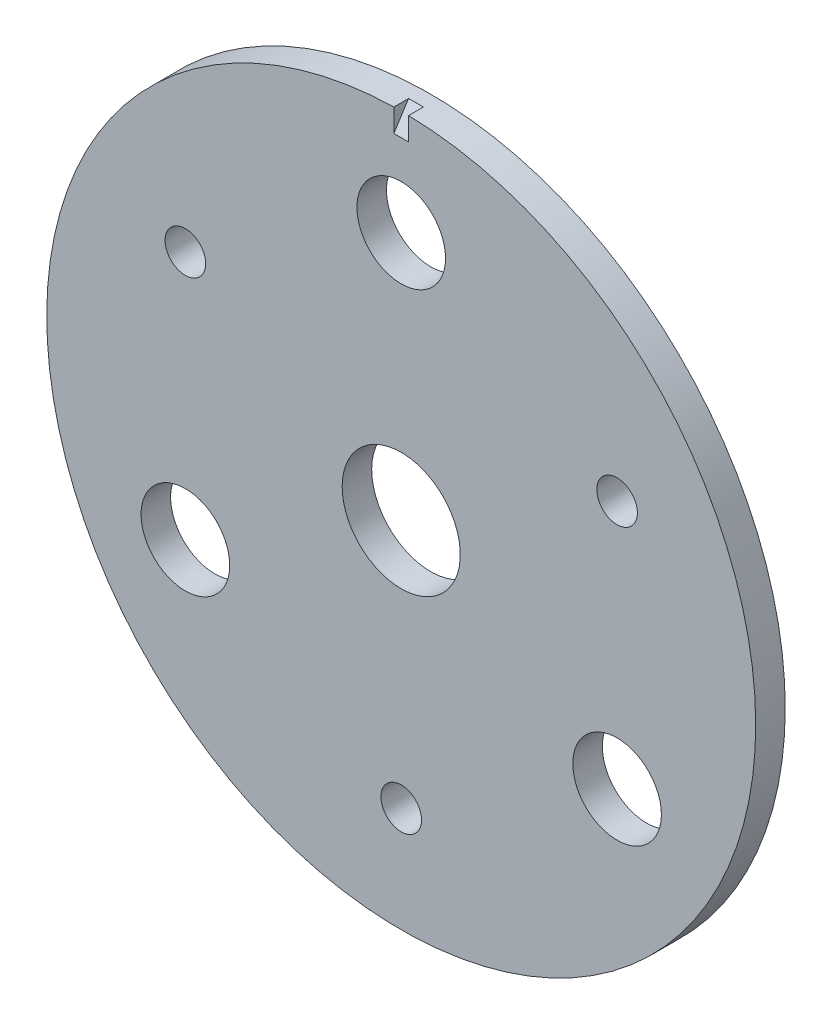
ISO-10303-21;
HEADER;
FILE_DESCRIPTION(('STEP AP214'),'2;1');
FILE_NAME('part.step','',(''),(''),'','','');
FILE_SCHEMA(('AUTOMOTIVE_DESIGN { 1 0 10303 214 1 1 1 1 }'));
ENDSEC;
DATA;
#1=APPLICATION_CONTEXT('core data for automotive mechanical design processes');
#2=APPLICATION_PROTOCOL_DEFINITION('international standard','automotive_design',2000,#1);
#3=PRODUCT_CONTEXT('',#1,'mechanical');
#4=PRODUCT('Part','Part','',(#3));
#5=PRODUCT_RELATED_PRODUCT_CATEGORY('part','',(#4));
#6=PRODUCT_DEFINITION_FORMATION('','',#4);
#7=PRODUCT_DEFINITION_CONTEXT('part definition',#1,'design');
#8=PRODUCT_DEFINITION('design','',#6,#7);
#9=PRODUCT_DEFINITION_SHAPE('','',#8);
#10=(LENGTH_UNIT() NAMED_UNIT(*) SI_UNIT(.MILLI.,.METRE.));
#11=(NAMED_UNIT(*) PLANE_ANGLE_UNIT() SI_UNIT($,.RADIAN.));
#12=(NAMED_UNIT(*) SI_UNIT($,.STERADIAN.) SOLID_ANGLE_UNIT());
#13=UNCERTAINTY_MEASURE_WITH_UNIT(LENGTH_MEASURE(1.E-05),#10,'distance_accuracy_value','');
#14=(GEOMETRIC_REPRESENTATION_CONTEXT(3) GLOBAL_UNCERTAINTY_ASSIGNED_CONTEXT((#13)) GLOBAL_UNIT_ASSIGNED_CONTEXT((#10,
#11,#12)) REPRESENTATION_CONTEXT('',''));
#15=CARTESIAN_POINT('',(0.,0.,0.));
#16=DIRECTION('',(0.,0.,1.));
#17=DIRECTION('',(1.,0.,0.));
#18=AXIS2_PLACEMENT_3D('',#15,#16,#17);
#19=CARTESIAN_POINT('',(0.,0.,2.));
#20=DIRECTION('',(0.,0.,1.));
#21=DIRECTION('',(1.,0.,0.));
#22=AXIS2_PLACEMENT_3D('',#19,#20,#21);
#23=PLANE('',#22);
#24=CARTESIAN_POINT('',(29.2283573777248,16.875,2.));
#25=DIRECTION('',(0.,0.,1.));
#26=DIRECTION('',(1.,0.,0.));
#27=AXIS2_PLACEMENT_3D('',#24,#25,#26);
#28=CIRCLE('',#27,2.75);
#29=CARTESIAN_POINT('',(26.4783573777248,16.875,2.));
#30=VERTEX_POINT('',#29);
#31=EDGE_CURVE('E44',#30,#30,#28,.F.);
#32=ORIENTED_EDGE('',*,*,#31,.T.);
#33=EDGE_LOOP('',(#32));
#34=FACE_BOUND('',#33,.T.);
#35=CARTESIAN_POINT('',(-29.2283573777248,16.875,2.));
#36=DIRECTION('',(0.,0.,1.));
#37=DIRECTION('',(1.,0.,0.));
#38=AXIS2_PLACEMENT_3D('',#35,#36,#37);
#39=CIRCLE('',#38,2.75);
#40=CARTESIAN_POINT('',(-31.9783573777248,16.875,2.));
#41=VERTEX_POINT('',#40);
#42=EDGE_CURVE('E172',#41,#41,#39,.F.);
#43=ORIENTED_EDGE('',*,*,#42,.T.);
#44=EDGE_LOOP('',(#43));
#45=FACE_BOUND('',#44,.T.);
#46=CARTESIAN_POINT('',(0.,-33.75,2.));
#47=DIRECTION('',(0.,0.,1.));
#48=DIRECTION('',(1.,0.,0.));
#49=AXIS2_PLACEMENT_3D('',#46,#47,#48);
#50=CIRCLE('',#49,2.75);
#51=CARTESIAN_POINT('',(-2.75,-33.75,2.));
#52=VERTEX_POINT('',#51);
#53=EDGE_CURVE('E167',#52,#52,#50,.F.);
#54=ORIENTED_EDGE('',*,*,#53,.T.);
#55=EDGE_LOOP('',(#54));
#56=FACE_BOUND('',#55,.T.);
#57=CARTESIAN_POINT('',(-29.2283573777247,-16.8750000000001,2.));
#58=DIRECTION('',(0.,0.,1.));
#59=DIRECTION('',(1.,0.,0.));
#60=AXIS2_PLACEMENT_3D('',#57,#58,#59);
#61=CIRCLE('',#60,6.);
#62=CARTESIAN_POINT('',(-23.2283573777247,-16.8750000000001,2.));
#63=VERTEX_POINT('',#62);
#64=EDGE_CURVE('E115',#63,#63,#61,.T.);
#65=ORIENTED_EDGE('',*,*,#64,.F.);
#66=EDGE_LOOP('',(#65));
#67=FACE_BOUND('',#66,.T.);
#68=CARTESIAN_POINT('',(29.228357377725,-16.8749999999997,2.));
#69=DIRECTION('',(0.,0.,1.));
#70=DIRECTION('',(1.,0.,0.));
#71=AXIS2_PLACEMENT_3D('',#68,#69,#70);
#72=CIRCLE('',#71,6.);
#73=CARTESIAN_POINT('',(35.228357377725,-16.8749999999997,2.));
#74=VERTEX_POINT('',#73);
#75=EDGE_CURVE('E110',#74,#74,#72,.T.);
#76=ORIENTED_EDGE('',*,*,#75,.F.);
#77=EDGE_LOOP('',(#76));
#78=FACE_BOUND('',#77,.T.);
#79=CARTESIAN_POINT('',(0.,33.75,2.000012));
#80=DIRECTION('',(0.,0.,1.));
#81=DIRECTION('',(1.,0.,0.));
#82=AXIS2_PLACEMENT_3D('',#79,#80,#81);
#83=CIRCLE('',#82,6.);
#84=CARTESIAN_POINT('',(6.,33.75,2.000012));
#85=VERTEX_POINT('',#84);
#86=EDGE_CURVE('E116',#85,#85,#83,.T.);
#87=ORIENTED_EDGE('',*,*,#86,.F.);
#88=EDGE_LOOP('',(#87));
#89=FACE_BOUND('',#88,.T.);
#90=CARTESIAN_POINT('',(0.,0.,2.));
#91=DIRECTION('',(0.,0.,1.));
#92=DIRECTION('',(1.,0.,0.));
#93=AXIS2_PLACEMENT_3D('',#90,#91,#92);
#94=CIRCLE('',#93,8.);
#95=CARTESIAN_POINT('',(-8.,0.,2.));
#96=VERTEX_POINT('',#95);
#97=EDGE_CURVE('E129',#96,#96,#94,.T.);
#98=ORIENTED_EDGE('',*,*,#97,.F.);
#99=EDGE_LOOP('',(#98));
#100=FACE_BOUND('',#99,.T.);
#101=CARTESIAN_POINT('',(0.,0.,2.));
#102=DIRECTION('',(0.,0.,1.));
#103=DIRECTION('',(1.,0.,0.));
#104=AXIS2_PLACEMENT_3D('',#101,#102,#103);
#105=CIRCLE('',#104,48.);
#106=CARTESIAN_POINT('',(-1.,47.9895822028073,2.));
#107=VERTEX_POINT('',#106);
#108=CARTESIAN_POINT('',(1.,47.9895822028073,2.));
#109=VERTEX_POINT('',#108);
#110=EDGE_CURVE('E170',#107,#109,#105,.T.);
#111=ORIENTED_EDGE('',*,*,#110,.T.);
#112=DIRECTION('',(0.,-1.,0.));
#113=VECTOR('',#112,1.);
#114=CARTESIAN_POINT('',(1.,48.,2.));
#115=LINE('',#114,#113);
#116=CARTESIAN_POINT('',(1.,44.8897446082717,2.));
#117=VERTEX_POINT('',#116);
#118=EDGE_CURVE('E56',#109,#117,#115,.T.);
#119=ORIENTED_EDGE('',*,*,#118,.T.);
#120=DIRECTION('',(1.,0.,0.));
#121=VECTOR('',#120,1.);
#122=CARTESIAN_POINT('',(-1.,44.8897446082717,2.));
#123=LINE('',#122,#121);
#124=CARTESIAN_POINT('',(-1.,44.8897446082717,2.));
#125=VERTEX_POINT('',#124);
#126=EDGE_CURVE('E91',#125,#117,#123,.T.);
#127=ORIENTED_EDGE('',*,*,#126,.F.);
#128=DIRECTION('',(0.,-1.,0.));
#129=VECTOR('',#128,1.);
#130=CARTESIAN_POINT('',(-0.999999999999999,48.,2.));
#131=LINE('',#130,#129);
#132=EDGE_CURVE('E78',#107,#125,#131,.T.);
#133=ORIENTED_EDGE('',*,*,#132,.F.);
#134=EDGE_LOOP('',(#111,#119,#127,#133));
#135=FACE_BOUND('',#134,.T.);
#136=ADVANCED_FACE('F41',(#34,#45,#56,#67,#78,#89,#100,#135),#23,.T.);
#137=CARTESIAN_POINT('',(0.,0.,-2.));
#138=DIRECTION('',(0.,0.,1.));
#139=DIRECTION('',(1.,0.,0.));
#140=AXIS2_PLACEMENT_3D('',#137,#138,#139);
#141=PLANE('',#140);
#142=CARTESIAN_POINT('',(29.2283573777248,16.875,-2.));
#143=DIRECTION('',(0.,0.,1.));
#144=DIRECTION('',(-0.5,0.866025403784439,0.));
#145=AXIS2_PLACEMENT_3D('',#142,#143,#144);
#146=CIRCLE('',#145,2.75);
#147=CARTESIAN_POINT('',(26.4783573777248,16.875,-2.));
#148=VERTEX_POINT('',#147);
#149=EDGE_CURVE('E180',#148,#148,#146,.T.);
#150=ORIENTED_EDGE('',*,*,#149,.T.);
#151=EDGE_LOOP('',(#150));
#152=FACE_BOUND('',#151,.T.);
#153=CARTESIAN_POINT('',(-29.2283573777248,16.875,-2.));
#154=DIRECTION('',(0.,0.,1.));
#155=DIRECTION('',(-0.5,-0.866025403784438,0.));
#156=AXIS2_PLACEMENT_3D('',#153,#154,#155);
#157=CIRCLE('',#156,2.75);
#158=CARTESIAN_POINT('',(-31.9783573777248,16.875,-2.));
#159=VERTEX_POINT('',#158);
#160=EDGE_CURVE('E184',#159,#159,#157,.T.);
#161=ORIENTED_EDGE('',*,*,#160,.T.);
#162=EDGE_LOOP('',(#161));
#163=FACE_BOUND('',#162,.T.);
#164=CARTESIAN_POINT('',(0.,-33.75,-2.));
#165=DIRECTION('',(0.,0.,1.));
#166=DIRECTION('',(1.,0.,0.));
#167=AXIS2_PLACEMENT_3D('',#164,#165,#166);
#168=CIRCLE('',#167,2.75);
#169=CARTESIAN_POINT('',(-2.75,-33.75,-2.));
#170=VERTEX_POINT('',#169);
#171=EDGE_CURVE('E173',#170,#170,#168,.T.);
#172=ORIENTED_EDGE('',*,*,#171,.T.);
#173=EDGE_LOOP('',(#172));
#174=FACE_BOUND('',#173,.T.);
#175=CARTESIAN_POINT('',(-29.2283573777247,-16.8750000000001,-2.));
#176=DIRECTION('',(0.,0.,1.));
#177=DIRECTION('',(-0.500000000000004,0.866025403784437,0.));
#178=AXIS2_PLACEMENT_3D('',#175,#176,#177);
#179=CIRCLE('',#178,6.);
#180=CARTESIAN_POINT('',(-23.2283573777247,-16.8750000000001,-2.));
#181=VERTEX_POINT('',#180);
#182=EDGE_CURVE('E99',#181,#181,#179,.T.);
#183=ORIENTED_EDGE('',*,*,#182,.T.);
#184=EDGE_LOOP('',(#183));
#185=FACE_BOUND('',#184,.T.);
#186=CARTESIAN_POINT('',(29.228357377725,-16.8749999999997,-2.));
#187=DIRECTION('',(0.,0.,1.));
#188=DIRECTION('',(-0.499999999999992,-0.866025403784443,0.));
#189=AXIS2_PLACEMENT_3D('',#186,#187,#188);
#190=CIRCLE('',#189,6.);
#191=CARTESIAN_POINT('',(35.228357377725,-16.8749999999997,-2.));
#192=VERTEX_POINT('',#191);
#193=EDGE_CURVE('E95',#192,#192,#190,.T.);
#194=ORIENTED_EDGE('',*,*,#193,.T.);
#195=EDGE_LOOP('',(#194));
#196=FACE_BOUND('',#195,.T.);
#197=CARTESIAN_POINT('',(0.,33.75,-2.));
#198=DIRECTION('',(0.,0.,1.));
#199=DIRECTION('',(1.,0.,0.));
#200=AXIS2_PLACEMENT_3D('',#197,#198,#199);
#201=CIRCLE('',#200,6.);
#202=CARTESIAN_POINT('',(6.,33.75,-2.));
#203=VERTEX_POINT('',#202);
#204=EDGE_CURVE('E120',#203,#203,#201,.T.);
#205=ORIENTED_EDGE('',*,*,#204,.T.);
#206=EDGE_LOOP('',(#205));
#207=FACE_BOUND('',#206,.T.);
#208=CARTESIAN_POINT('',(0.,0.,-2.));
#209=DIRECTION('',(0.,0.,1.));
#210=DIRECTION('',(1.,0.,0.));
#211=AXIS2_PLACEMENT_3D('',#208,#209,#210);
#212=CIRCLE('',#211,48.);
#213=CARTESIAN_POINT('',(48.,0.,-2.));
#214=VERTEX_POINT('',#213);
#215=EDGE_CURVE('E204',#214,#214,#212,.T.);
#216=ORIENTED_EDGE('',*,*,#215,.F.);
#217=EDGE_LOOP('',(#216));
#218=FACE_BOUND('',#217,.T.);
#219=CARTESIAN_POINT('',(0.,0.,-2.));
#220=DIRECTION('',(0.,0.,1.));
#221=DIRECTION('',(1.,0.,0.));
#222=AXIS2_PLACEMENT_3D('',#219,#220,#221);
#223=CIRCLE('',#222,8.);
#224=CARTESIAN_POINT('',(-8.,0.,-2.));
#225=VERTEX_POINT('',#224);
#226=EDGE_CURVE('E122',#225,#225,#223,.T.);
#227=ORIENTED_EDGE('',*,*,#226,.T.);
#228=EDGE_LOOP('',(#227));
#229=FACE_BOUND('',#228,.T.);
#230=ADVANCED_FACE('F153',(#152,#163,#174,#185,#196,#207,#218,#229),#141,.F.);
#231=CARTESIAN_POINT('',(0.,0.,2.));
#232=DIRECTION('',(0.,0.,-1.));
#233=DIRECTION('',(-1.,0.,0.));
#234=AXIS2_PLACEMENT_3D('',#231,#232,#233);
#235=CYLINDRICAL_SURFACE('',#234,48.);
#236=DIRECTION('',(0.,0.,-1.));
#237=VECTOR('',#236,1.);
#238=CARTESIAN_POINT('',(-1.,47.9895822028073,2.));
#239=LINE('',#238,#237);
#240=CARTESIAN_POINT('',(-1.,47.9895822028073,0.006698997915347));
#241=VERTEX_POINT('',#240);
#242=EDGE_CURVE('E11',#107,#241,#239,.T.);
#243=ORIENTED_EDGE('',*,*,#242,.T.);
#244=CARTESIAN_POINT('',(0.,0.,30.8656325314346));
#245=DIRECTION('',(0.,-0.540862850942179,-0.841110799164235));
#246=DIRECTION('',(0.,0.841110799164235,-0.540862850942178));
#247=AXIS2_PLACEMENT_3D('',#244,#245,#246);
#248=ELLIPSE('',#247,57.0673923669687,48.);
#249=CARTESIAN_POINT('',(1.,47.9895822028073,0.006698997915347));
#250=VERTEX_POINT('',#249);
#251=EDGE_CURVE('E51',#241,#250,#248,.T.);
#252=ORIENTED_EDGE('',*,*,#251,.T.);
#253=DIRECTION('',(0.,0.,-1.));
#254=VECTOR('',#253,1.);
#255=CARTESIAN_POINT('',(1.,47.9895822028073,2.));
#256=LINE('',#255,#254);
#257=EDGE_CURVE('E158',#109,#250,#256,.T.);
#258=ORIENTED_EDGE('',*,*,#257,.F.);
#259=ORIENTED_EDGE('',*,*,#110,.F.);
#260=EDGE_LOOP('',(#243,#252,#258,#259));
#261=FACE_BOUND('',#260,.T.);
#262=ORIENTED_EDGE('',*,*,#215,.T.);
#263=EDGE_LOOP('',(#262));
#264=FACE_BOUND('',#263,.T.);
#265=ADVANCED_FACE('F43',(#261,#264),#235,.T.);
#266=CARTESIAN_POINT('',(0.,0.,2.));
#267=DIRECTION('',(0.,0.,-1.));
#268=DIRECTION('',(-1.,0.,0.));
#269=AXIS2_PLACEMENT_3D('',#266,#267,#268);
#270=CYLINDRICAL_SURFACE('',#269,8.);
#271=CARTESIAN_POINT('',(-8.,0.,2.));
#272=CARTESIAN_POINT('',(-8.,0.,1.95833333333333));
#273=CARTESIAN_POINT('',(-8.,0.,1.91666666666667));
#274=CARTESIAN_POINT('',(-8.,0.,1.83333333333333));
#275=CARTESIAN_POINT('',(-8.,0.,1.79166666666667));
#276=CARTESIAN_POINT('',(-8.,0.,1.70833333333333));
#277=CARTESIAN_POINT('',(-8.,0.,1.66666666666667));
#278=CARTESIAN_POINT('',(-8.,0.,1.58333333333333));
#279=CARTESIAN_POINT('',(-8.,0.,1.54166666666667));
#280=CARTESIAN_POINT('',(-8.,0.,1.45833333333333));
#281=CARTESIAN_POINT('',(-8.,0.,1.41666666666667));
#282=CARTESIAN_POINT('',(-8.,0.,1.33333333333333));
#283=CARTESIAN_POINT('',(-8.,0.,1.29166666666667));
#284=CARTESIAN_POINT('',(-8.,0.,1.20833333333333));
#285=CARTESIAN_POINT('',(-8.,0.,1.16666666666667));
#286=CARTESIAN_POINT('',(-8.,0.,1.08333333333333));
#287=CARTESIAN_POINT('',(-8.,0.,1.04166666666667));
#288=CARTESIAN_POINT('',(-8.,0.,0.958333333333333));
#289=CARTESIAN_POINT('',(-8.,0.,0.916666666666666));
#290=CARTESIAN_POINT('',(-8.,0.,0.833333333333333));
#291=CARTESIAN_POINT('',(-8.,0.,0.791666666666666));
#292=CARTESIAN_POINT('',(-8.,0.,0.708333333333333));
#293=CARTESIAN_POINT('',(-8.,0.,0.666666666666666));
#294=CARTESIAN_POINT('',(-8.,0.,0.583333333333333));
#295=CARTESIAN_POINT('',(-8.,0.,0.541666666666666));
#296=CARTESIAN_POINT('',(-8.,0.,0.458333333333333));
#297=CARTESIAN_POINT('',(-8.,0.,0.416666666666666));
#298=CARTESIAN_POINT('',(-8.,0.,0.333333333333333));
#299=CARTESIAN_POINT('',(-8.,0.,0.291666666666666));
#300=CARTESIAN_POINT('',(-8.,0.,0.208333333333333));
#301=CARTESIAN_POINT('',(-8.,0.,0.166666666666666));
#302=CARTESIAN_POINT('',(-8.,0.,0.0833333333333328));
#303=CARTESIAN_POINT('',(-8.,0.,0.0416666666666662));
#304=CARTESIAN_POINT('',(-8.,0.,-0.0416666666666671));
#305=CARTESIAN_POINT('',(-8.,0.,-0.0833333333333338));
#306=CARTESIAN_POINT('',(-8.,0.,-0.166666666666667));
#307=CARTESIAN_POINT('',(-8.,0.,-0.208333333333334));
#308=CARTESIAN_POINT('',(-8.,0.,-0.291666666666667));
#309=CARTESIAN_POINT('',(-8.,0.,-0.333333333333334));
#310=CARTESIAN_POINT('',(-8.,0.,-0.416666666666667));
#311=CARTESIAN_POINT('',(-8.,0.,-0.458333333333334));
#312=CARTESIAN_POINT('',(-8.,0.,-0.541666666666667));
#313=CARTESIAN_POINT('',(-8.,0.,-0.583333333333334));
#314=CARTESIAN_POINT('',(-8.,0.,-0.666666666666667));
#315=CARTESIAN_POINT('',(-8.,0.,-0.708333333333334));
#316=CARTESIAN_POINT('',(-8.,0.,-0.791666666666667));
#317=CARTESIAN_POINT('',(-8.,0.,-0.833333333333334));
#318=CARTESIAN_POINT('',(-8.,0.,-0.916666666666667));
#319=CARTESIAN_POINT('',(-8.,0.,-0.958333333333334));
#320=CARTESIAN_POINT('',(-8.,0.,-1.04166666666667));
#321=CARTESIAN_POINT('',(-8.,0.,-1.08333333333333));
#322=CARTESIAN_POINT('',(-8.,0.,-1.16666666666667));
#323=CARTESIAN_POINT('',(-8.,0.,-1.20833333333333));
#324=CARTESIAN_POINT('',(-8.,0.,-1.29166666666667));
#325=CARTESIAN_POINT('',(-8.,0.,-1.33333333333333));
#326=CARTESIAN_POINT('',(-8.,0.,-1.41666666666667));
#327=CARTESIAN_POINT('',(-8.,0.,-1.45833333333333));
#328=CARTESIAN_POINT('',(-8.,0.,-1.54166666666667));
#329=CARTESIAN_POINT('',(-8.,0.,-1.58333333333333));
#330=CARTESIAN_POINT('',(-8.,0.,-1.66666666666667));
#331=CARTESIAN_POINT('',(-8.,0.,-1.70833333333333));
#332=CARTESIAN_POINT('',(-8.,0.,-1.79166666666667));
#333=CARTESIAN_POINT('',(-8.,0.,-1.83333333333333));
#334=CARTESIAN_POINT('',(-8.,0.,-1.91666666666667));
#335=CARTESIAN_POINT('',(-8.,0.,-1.95833333333333));
#336=CARTESIAN_POINT('',(-8.,0.,-2.));
#337=B_SPLINE_CURVE_WITH_KNOTS('',3,(#271,#272,#273,#274,#275,#276,#277,#278,#279,#280,#281,
#282,#283,#284,#285,#286,#287,#288,#289,#290,#291,#292,#293,#294,#295,#296,#297,#298,#299,#300,
#301,#302,#303,#304,#305,#306,#307,#308,#309,#310,#311,#312,#313,#314,#315,#316,#317,#318,#319,
#320,#321,#322,#323,#324,#325,#326,#327,#328,#329,#330,#331,#332,#333,#334,#335,#336),
.UNSPECIFIED.,.F.,.F.,(4,2,2,2,2,2,2,2,2,2,2,2,2,2,2,2,2,2,2,2,2,2,2,2,2,2,2,2,2,2,2,2,4),(0.,
0.125,0.25,0.375,0.5,0.625000000000001,0.75,0.875,1.,1.125,1.25,1.375,1.5,1.625,1.75,1.875,2.,
2.125,2.25,2.375,2.5,2.625,2.75,2.875,3.,3.125,3.25,3.375,3.5,3.625,3.75,3.875,4.),.UNSPECIFIED.);
#338=EDGE_CURVE('BSEAM141',#96,#225,#337,.T.);
#339=ORIENTED_EDGE('',*,*,#97,.T.);
#340=ORIENTED_EDGE('',*,*,#226,.F.);
#341=ORIENTED_EDGE('',*,*,#338,.T.);
#342=ORIENTED_EDGE('',*,*,#338,.F.);
#343=EDGE_LOOP('',(#339,#341,#340,#342));
#344=FACE_BOUND('',#343,.T.);
#345=ADVANCED_FACE('F141',(#344),#270,.F.);
#346=CARTESIAN_POINT('',(0.,33.75,-2.));
#347=DIRECTION('',(0.,0.,1.));
#348=DIRECTION('',(1.,0.,0.));
#349=AXIS2_PLACEMENT_3D('',#346,#347,#348);
#350=CYLINDRICAL_SURFACE('',#349,6.);
#351=ORIENTED_EDGE('',*,*,#204,.F.);
#352=EDGE_LOOP('',(#351));
#353=FACE_BOUND('',#352,.T.);
#354=ORIENTED_EDGE('',*,*,#86,.T.);
#355=EDGE_LOOP('',(#354));
#356=FACE_BOUND('',#355,.T.);
#357=ADVANCED_FACE('F135',(#353,#356),#350,.F.);
#358=CARTESIAN_POINT('',(29.228357377725,-16.8749999999997,-2.));
#359=DIRECTION('',(0.,0.,1.));
#360=DIRECTION('',(1.,0.,0.));
#361=AXIS2_PLACEMENT_3D('',#358,#359,#360);
#362=CYLINDRICAL_SURFACE('',#361,6.);
#363=CARTESIAN_POINT('',(35.228357377725,-16.8749999999997,2.));
#364=CARTESIAN_POINT('',(35.228357377725,-16.8749999999997,1.95833333333333));
#365=CARTESIAN_POINT('',(35.228357377725,-16.8749999999997,1.91666666666667));
#366=CARTESIAN_POINT('',(35.228357377725,-16.8749999999997,1.83333333333333));
#367=CARTESIAN_POINT('',(35.228357377725,-16.8749999999997,1.79166666666667));
#368=CARTESIAN_POINT('',(35.228357377725,-16.8749999999997,1.70833333333333));
#369=CARTESIAN_POINT('',(35.228357377725,-16.8749999999997,1.66666666666667));
#370=CARTESIAN_POINT('',(35.228357377725,-16.8749999999997,1.58333333333333));
#371=CARTESIAN_POINT('',(35.228357377725,-16.8749999999997,1.54166666666667));
#372=CARTESIAN_POINT('',(35.228357377725,-16.8749999999997,1.45833333333333));
#373=CARTESIAN_POINT('',(35.228357377725,-16.8749999999997,1.41666666666667));
#374=CARTESIAN_POINT('',(35.228357377725,-16.8749999999997,1.33333333333333));
#375=CARTESIAN_POINT('',(35.228357377725,-16.8749999999997,1.29166666666667));
#376=CARTESIAN_POINT('',(35.228357377725,-16.8749999999997,1.20833333333333));
#377=CARTESIAN_POINT('',(35.228357377725,-16.8749999999997,1.16666666666667));
#378=CARTESIAN_POINT('',(35.228357377725,-16.8749999999997,1.08333333333333));
#379=CARTESIAN_POINT('',(35.228357377725,-16.8749999999997,1.04166666666667));
#380=CARTESIAN_POINT('',(35.228357377725,-16.8749999999997,0.958333333333334));
#381=CARTESIAN_POINT('',(35.228357377725,-16.8749999999997,0.916666666666668));
#382=CARTESIAN_POINT('',(35.228357377725,-16.8749999999997,0.833333333333334));
#383=CARTESIAN_POINT('',(35.228357377725,-16.8749999999997,0.791666666666668));
#384=CARTESIAN_POINT('',(35.228357377725,-16.8749999999997,0.708333333333335));
#385=CARTESIAN_POINT('',(35.228357377725,-16.8749999999997,0.666666666666668));
#386=CARTESIAN_POINT('',(35.228357377725,-16.8749999999997,0.583333333333335));
#387=CARTESIAN_POINT('',(35.228357377725,-16.8749999999997,0.541666666666668));
#388=CARTESIAN_POINT('',(35.228357377725,-16.8749999999997,0.458333333333335));
#389=CARTESIAN_POINT('',(35.228357377725,-16.8749999999997,0.416666666666668));
#390=CARTESIAN_POINT('',(35.228357377725,-16.8749999999997,0.333333333333335));
#391=CARTESIAN_POINT('',(35.228357377725,-16.8749999999997,0.291666666666668));
#392=CARTESIAN_POINT('',(35.228357377725,-16.8749999999997,0.208333333333335));
#393=CARTESIAN_POINT('',(35.228357377725,-16.8749999999997,0.166666666666668));
#394=CARTESIAN_POINT('',(35.228357377725,-16.8749999999997,0.0833333333333347));
#395=CARTESIAN_POINT('',(35.228357377725,-16.8749999999997,0.041666666666668));
#396=CARTESIAN_POINT('',(35.228357377725,-16.8749999999997,-0.0416666666666654));
#397=CARTESIAN_POINT('',(35.228357377725,-16.8749999999997,-0.0833333333333321));
#398=CARTESIAN_POINT('',(35.228357377725,-16.8749999999997,-0.166666666666665));
#399=CARTESIAN_POINT('',(35.228357377725,-16.8749999999997,-0.208333333333332));
#400=CARTESIAN_POINT('',(35.228357377725,-16.8749999999997,-0.291666666666666));
#401=CARTESIAN_POINT('',(35.228357377725,-16.8749999999997,-0.333333333333332));
#402=CARTESIAN_POINT('',(35.228357377725,-16.8749999999997,-0.416666666666665));
#403=CARTESIAN_POINT('',(35.228357377725,-16.8749999999997,-0.458333333333332));
#404=CARTESIAN_POINT('',(35.228357377725,-16.8749999999997,-0.541666666666665));
#405=CARTESIAN_POINT('',(35.228357377725,-16.8749999999997,-0.583333333333332));
#406=CARTESIAN_POINT('',(35.228357377725,-16.8749999999997,-0.666666666666665));
#407=CARTESIAN_POINT('',(35.228357377725,-16.8749999999997,-0.708333333333332));
#408=CARTESIAN_POINT('',(35.228357377725,-16.8749999999997,-0.791666666666665));
#409=CARTESIAN_POINT('',(35.228357377725,-16.8749999999997,-0.833333333333332));
#410=CARTESIAN_POINT('',(35.228357377725,-16.8749999999997,-0.916666666666665));
#411=CARTESIAN_POINT('',(35.228357377725,-16.8749999999997,-0.958333333333332));
#412=CARTESIAN_POINT('',(35.228357377725,-16.8749999999997,-1.04166666666667));
#413=CARTESIAN_POINT('',(35.228357377725,-16.8749999999997,-1.08333333333333));
#414=CARTESIAN_POINT('',(35.228357377725,-16.8749999999997,-1.16666666666667));
#415=CARTESIAN_POINT('',(35.228357377725,-16.8749999999997,-1.20833333333333));
#416=CARTESIAN_POINT('',(35.228357377725,-16.8749999999997,-1.29166666666667));
#417=CARTESIAN_POINT('',(35.228357377725,-16.8749999999997,-1.33333333333333));
#418=CARTESIAN_POINT('',(35.228357377725,-16.8749999999997,-1.41666666666666));
#419=CARTESIAN_POINT('',(35.228357377725,-16.8749999999997,-1.45833333333333));
#420=CARTESIAN_POINT('',(35.228357377725,-16.8749999999997,-1.54166666666666));
#421=CARTESIAN_POINT('',(35.228357377725,-16.8749999999997,-1.58333333333333));
#422=CARTESIAN_POINT('',(35.228357377725,-16.8749999999997,-1.66666666666666));
#423=CARTESIAN_POINT('',(35.228357377725,-16.8749999999997,-1.70833333333333));
#424=CARTESIAN_POINT('',(35.228357377725,-16.8749999999997,-1.79166666666666));
#425=CARTESIAN_POINT('',(35.228357377725,-16.8749999999997,-1.83333333333333));
#426=CARTESIAN_POINT('',(35.228357377725,-16.8749999999997,-1.91666666666666));
#427=CARTESIAN_POINT('',(35.228357377725,-16.8749999999997,-1.95833333333333));
#428=CARTESIAN_POINT('',(35.228357377725,-16.8749999999997,-2.));
#429=B_SPLINE_CURVE_WITH_KNOTS('',3,(#363,#364,#365,#366,#367,#368,#369,#370,#371,#372,#373,
#374,#375,#376,#377,#378,#379,#380,#381,#382,#383,#384,#385,#386,#387,#388,#389,#390,#391,#392,
#393,#394,#395,#396,#397,#398,#399,#400,#401,#402,#403,#404,#405,#406,#407,#408,#409,#410,#411,
#412,#413,#414,#415,#416,#417,#418,#419,#420,#421,#422,#423,#424,#425,#426,#427,#428),
.UNSPECIFIED.,.F.,.F.,(4,2,2,2,2,2,2,2,2,2,2,2,2,2,2,2,2,2,2,2,2,2,2,2,2,2,2,2,2,2,2,2,4),(0.,
0.125,0.25,0.375,0.5,0.625,0.75,0.875,1.,1.125,1.25,1.375,1.5,1.625,1.75,1.875,2.,2.125,2.25,
2.375,2.5,2.625,2.75,2.875,3.,3.125,3.25,3.375,3.5,3.625,3.75,3.875,4.),.UNSPECIFIED.);
#430=EDGE_CURVE('BSEAM145',#74,#192,#429,.T.);
#431=ORIENTED_EDGE('',*,*,#75,.T.);
#432=ORIENTED_EDGE('',*,*,#193,.F.);
#433=ORIENTED_EDGE('',*,*,#430,.T.);
#434=ORIENTED_EDGE('',*,*,#430,.F.);
#435=EDGE_LOOP('',(#431,#433,#432,#434));
#436=FACE_BOUND('',#435,.T.);
#437=ADVANCED_FACE('F145',(#436),#362,.F.);
#438=CARTESIAN_POINT('',(-29.2283573777247,-16.8750000000001,-2.));
#439=DIRECTION('',(0.,0.,1.));
#440=DIRECTION('',(1.,0.,0.));
#441=AXIS2_PLACEMENT_3D('',#438,#439,#440);
#442=CYLINDRICAL_SURFACE('',#441,6.);
#443=CARTESIAN_POINT('',(-23.2283573777247,-16.8750000000001,2.));
#444=CARTESIAN_POINT('',(-23.2283573777247,-16.8750000000001,1.95833333333333));
#445=CARTESIAN_POINT('',(-23.2283573777247,-16.8750000000001,1.91666666666667));
#446=CARTESIAN_POINT('',(-23.2283573777247,-16.8750000000001,1.83333333333333));
#447=CARTESIAN_POINT('',(-23.2283573777247,-16.8750000000001,1.79166666666667));
#448=CARTESIAN_POINT('',(-23.2283573777247,-16.8750000000001,1.70833333333333));
#449=CARTESIAN_POINT('',(-23.2283573777247,-16.8750000000001,1.66666666666667));
#450=CARTESIAN_POINT('',(-23.2283573777247,-16.8750000000001,1.58333333333333));
#451=CARTESIAN_POINT('',(-23.2283573777247,-16.8750000000001,1.54166666666667));
#452=CARTESIAN_POINT('',(-23.2283573777247,-16.8750000000001,1.45833333333333));
#453=CARTESIAN_POINT('',(-23.2283573777247,-16.8750000000001,1.41666666666667));
#454=CARTESIAN_POINT('',(-23.2283573777247,-16.8750000000001,1.33333333333333));
#455=CARTESIAN_POINT('',(-23.2283573777247,-16.8750000000001,1.29166666666667));
#456=CARTESIAN_POINT('',(-23.2283573777247,-16.8750000000001,1.20833333333333));
#457=CARTESIAN_POINT('',(-23.2283573777247,-16.8750000000001,1.16666666666667));
#458=CARTESIAN_POINT('',(-23.2283573777247,-16.8750000000001,1.08333333333333));
#459=CARTESIAN_POINT('',(-23.2283573777247,-16.8750000000001,1.04166666666667));
#460=CARTESIAN_POINT('',(-23.2283573777247,-16.8750000000001,0.958333333333334));
#461=CARTESIAN_POINT('',(-23.2283573777247,-16.8750000000001,0.916666666666668));
#462=CARTESIAN_POINT('',(-23.2283573777247,-16.8750000000001,0.833333333333334));
#463=CARTESIAN_POINT('',(-23.2283573777247,-16.8750000000001,0.791666666666668));
#464=CARTESIAN_POINT('',(-23.2283573777247,-16.8750000000001,0.708333333333335));
#465=CARTESIAN_POINT('',(-23.2283573777247,-16.8750000000001,0.666666666666668));
#466=CARTESIAN_POINT('',(-23.2283573777247,-16.8750000000001,0.583333333333335));
#467=CARTESIAN_POINT('',(-23.2283573777247,-16.8750000000001,0.541666666666668));
#468=CARTESIAN_POINT('',(-23.2283573777247,-16.8750000000001,0.458333333333335));
#469=CARTESIAN_POINT('',(-23.2283573777247,-16.8750000000001,0.416666666666668));
#470=CARTESIAN_POINT('',(-23.2283573777247,-16.8750000000001,0.333333333333335));
#471=CARTESIAN_POINT('',(-23.2283573777247,-16.8750000000001,0.291666666666668));
#472=CARTESIAN_POINT('',(-23.2283573777247,-16.8750000000001,0.208333333333335));
#473=CARTESIAN_POINT('',(-23.2283573777247,-16.8750000000001,0.166666666666668));
#474=CARTESIAN_POINT('',(-23.2283573777247,-16.8750000000001,0.0833333333333347));
#475=CARTESIAN_POINT('',(-23.2283573777247,-16.8750000000001,0.041666666666668));
#476=CARTESIAN_POINT('',(-23.2283573777247,-16.8750000000001,-0.0416666666666654));
#477=CARTESIAN_POINT('',(-23.2283573777247,-16.8750000000001,-0.0833333333333321));
#478=CARTESIAN_POINT('',(-23.2283573777247,-16.8750000000001,-0.166666666666665));
#479=CARTESIAN_POINT('',(-23.2283573777247,-16.8750000000001,-0.208333333333332));
#480=CARTESIAN_POINT('',(-23.2283573777247,-16.8750000000001,-0.291666666666666));
#481=CARTESIAN_POINT('',(-23.2283573777247,-16.8750000000001,-0.333333333333332));
#482=CARTESIAN_POINT('',(-23.2283573777247,-16.8750000000001,-0.416666666666665));
#483=CARTESIAN_POINT('',(-23.2283573777247,-16.8750000000001,-0.458333333333332));
#484=CARTESIAN_POINT('',(-23.2283573777247,-16.8750000000001,-0.541666666666665));
#485=CARTESIAN_POINT('',(-23.2283573777247,-16.8750000000001,-0.583333333333332));
#486=CARTESIAN_POINT('',(-23.2283573777247,-16.8750000000001,-0.666666666666665));
#487=CARTESIAN_POINT('',(-23.2283573777247,-16.8750000000001,-0.708333333333332));
#488=CARTESIAN_POINT('',(-23.2283573777247,-16.8750000000001,-0.791666666666665));
#489=CARTESIAN_POINT('',(-23.2283573777247,-16.8750000000001,-0.833333333333332));
#490=CARTESIAN_POINT('',(-23.2283573777247,-16.8750000000001,-0.916666666666665));
#491=CARTESIAN_POINT('',(-23.2283573777247,-16.8750000000001,-0.958333333333332));
#492=CARTESIAN_POINT('',(-23.2283573777247,-16.8750000000001,-1.04166666666667));
#493=CARTESIAN_POINT('',(-23.2283573777247,-16.8750000000001,-1.08333333333333));
#494=CARTESIAN_POINT('',(-23.2283573777247,-16.8750000000001,-1.16666666666667));
#495=CARTESIAN_POINT('',(-23.2283573777247,-16.8750000000001,-1.20833333333333));
#496=CARTESIAN_POINT('',(-23.2283573777247,-16.8750000000001,-1.29166666666667));
#497=CARTESIAN_POINT('',(-23.2283573777247,-16.8750000000001,-1.33333333333333));
#498=CARTESIAN_POINT('',(-23.2283573777247,-16.8750000000001,-1.41666666666666));
#499=CARTESIAN_POINT('',(-23.2283573777247,-16.8750000000001,-1.45833333333333));
#500=CARTESIAN_POINT('',(-23.2283573777247,-16.8750000000001,-1.54166666666666));
#501=CARTESIAN_POINT('',(-23.2283573777247,-16.8750000000001,-1.58333333333333));
#502=CARTESIAN_POINT('',(-23.2283573777247,-16.8750000000001,-1.66666666666666));
#503=CARTESIAN_POINT('',(-23.2283573777247,-16.8750000000001,-1.70833333333333));
#504=CARTESIAN_POINT('',(-23.2283573777247,-16.8750000000001,-1.79166666666666));
#505=CARTESIAN_POINT('',(-23.2283573777247,-16.8750000000001,-1.83333333333333));
#506=CARTESIAN_POINT('',(-23.2283573777247,-16.8750000000001,-1.91666666666666));
#507=CARTESIAN_POINT('',(-23.2283573777247,-16.8750000000001,-1.95833333333333));
#508=CARTESIAN_POINT('',(-23.2283573777247,-16.8750000000001,-2.));
#509=B_SPLINE_CURVE_WITH_KNOTS('',3,(#443,#444,#445,#446,#447,#448,#449,#450,#451,#452,#453,
#454,#455,#456,#457,#458,#459,#460,#461,#462,#463,#464,#465,#466,#467,#468,#469,#470,#471,#472,
#473,#474,#475,#476,#477,#478,#479,#480,#481,#482,#483,#484,#485,#486,#487,#488,#489,#490,#491,
#492,#493,#494,#495,#496,#497,#498,#499,#500,#501,#502,#503,#504,#505,#506,#507,#508),
.UNSPECIFIED.,.F.,.F.,(4,2,2,2,2,2,2,2,2,2,2,2,2,2,2,2,2,2,2,2,2,2,2,2,2,2,2,2,2,2,2,2,4),(0.,
0.125,0.25,0.375,0.5,0.625,0.75,0.875,1.,1.125,1.25,1.375,1.5,1.625,1.75,1.875,2.,2.125,2.25,
2.375,2.5,2.625,2.75,2.875,3.,3.125,3.25,3.375,3.5,3.625,3.75,3.875,4.),.UNSPECIFIED.);
#510=EDGE_CURVE('BSEAM237',#63,#181,#509,.T.);
#511=ORIENTED_EDGE('',*,*,#64,.T.);
#512=ORIENTED_EDGE('',*,*,#182,.F.);
#513=ORIENTED_EDGE('',*,*,#510,.T.);
#514=ORIENTED_EDGE('',*,*,#510,.F.);
#515=EDGE_LOOP('',(#511,#513,#512,#514));
#516=FACE_BOUND('',#515,.T.);
#517=ADVANCED_FACE('F237',(#516),#442,.F.);
#518=CARTESIAN_POINT('',(-1.,44.8897446082717,2.));
#519=DIRECTION('',(0.,-0.540862850942179,-0.841110799164235));
#520=DIRECTION('',(0.,0.841110799164235,-0.540862850942178));
#521=AXIS2_PLACEMENT_3D('',#518,#519,#520);
#522=PLANE('',#521);
#523=ORIENTED_EDGE('',*,*,#251,.F.);
#524=DIRECTION('',(0.,0.841110799164235,-0.540862850942178));
#525=VECTOR('',#524,1.);
#526=CARTESIAN_POINT('',(-1.,44.8897446082717,2.));
#527=LINE('',#526,#525);
#528=EDGE_CURVE('E85',#125,#241,#527,.T.);
#529=ORIENTED_EDGE('',*,*,#528,.F.);
#530=ORIENTED_EDGE('',*,*,#126,.T.);
#531=DIRECTION('',(0.,0.841110799164235,-0.540862850942178));
#532=VECTOR('',#531,1.);
#533=CARTESIAN_POINT('',(1.,44.8897446082717,2.));
#534=LINE('',#533,#532);
#535=EDGE_CURVE('E86',#117,#250,#534,.T.);
#536=ORIENTED_EDGE('',*,*,#535,.T.);
#537=EDGE_LOOP('',(#523,#529,#530,#536));
#538=FACE_BOUND('',#537,.T.);
#539=ADVANCED_FACE('F87',(#538),#522,.F.);
#540=CARTESIAN_POINT('',(-1.,0.,0.));
#541=DIRECTION('',(-1.,0.,0.));
#542=DIRECTION('',(0.,0.,1.));
#543=AXIS2_PLACEMENT_3D('',#540,#541,#542);
#544=PLANE('',#543);
#545=ORIENTED_EDGE('',*,*,#132,.T.);
#546=ORIENTED_EDGE('',*,*,#528,.T.);
#547=ORIENTED_EDGE('',*,*,#242,.F.);
#548=EDGE_LOOP('',(#545,#546,#547));
#549=FACE_BOUND('',#548,.T.);
#550=ADVANCED_FACE('F81',(#549),#544,.F.);
#551=CARTESIAN_POINT('',(1.,0.,0.));
#552=DIRECTION('',(-1.,0.,0.));
#553=DIRECTION('',(0.,0.,1.));
#554=AXIS2_PLACEMENT_3D('',#551,#552,#553);
#555=PLANE('',#554);
#556=ORIENTED_EDGE('',*,*,#257,.T.);
#557=ORIENTED_EDGE('',*,*,#535,.F.);
#558=ORIENTED_EDGE('',*,*,#118,.F.);
#559=EDGE_LOOP('',(#556,#557,#558));
#560=FACE_BOUND('',#559,.T.);
#561=ADVANCED_FACE('F264',(#560),#555,.T.);
#562=CARTESIAN_POINT('',(0.,-33.75,2.16530031758062));
#563=DIRECTION('',(0.,0.,-1.));
#564=DIRECTION('',(-1.,0.,0.));
#565=AXIS2_PLACEMENT_3D('',#562,#563,#564);
#566=CYLINDRICAL_SURFACE('',#565,2.75);
#567=CARTESIAN_POINT('',(-2.75,-33.75,2.));
#568=CARTESIAN_POINT('',(-2.75,-33.75,1.95833333333333));
#569=CARTESIAN_POINT('',(-2.75,-33.75,1.91666666666666));
#570=CARTESIAN_POINT('',(-2.75,-33.75,1.83333333333333));
#571=CARTESIAN_POINT('',(-2.75,-33.75,1.79166666666666));
#572=CARTESIAN_POINT('',(-2.75,-33.75,1.70833333333333));
#573=CARTESIAN_POINT('',(-2.75,-33.75,1.66666666666666));
#574=CARTESIAN_POINT('',(-2.75,-33.75,1.58333333333333));
#575=CARTESIAN_POINT('',(-2.75,-33.75,1.54166666666666));
#576=CARTESIAN_POINT('',(-2.75,-33.75,1.45833333333333));
#577=CARTESIAN_POINT('',(-2.75,-33.75,1.41666666666666));
#578=CARTESIAN_POINT('',(-2.75,-33.75,1.33333333333333));
#579=CARTESIAN_POINT('',(-2.75,-33.75,1.29166666666666));
#580=CARTESIAN_POINT('',(-2.75,-33.75,1.20833333333333));
#581=CARTESIAN_POINT('',(-2.75,-33.75,1.16666666666666));
#582=CARTESIAN_POINT('',(-2.75,-33.75,1.08333333333333));
#583=CARTESIAN_POINT('',(-2.75,-33.75,1.04166666666666));
#584=CARTESIAN_POINT('',(-2.75,-33.75,0.958333333333332));
#585=CARTESIAN_POINT('',(-2.75,-33.75,0.916666666666665));
#586=CARTESIAN_POINT('',(-2.75,-33.75,0.833333333333332));
#587=CARTESIAN_POINT('',(-2.75,-33.75,0.791666666666665));
#588=CARTESIAN_POINT('',(-2.75,-33.75,0.708333333333332));
#589=CARTESIAN_POINT('',(-2.75,-33.75,0.666666666666665));
#590=CARTESIAN_POINT('',(-2.75,-33.75,0.583333333333332));
#591=CARTESIAN_POINT('',(-2.75,-33.75,0.541666666666665));
#592=CARTESIAN_POINT('',(-2.75,-33.75,0.458333333333332));
#593=CARTESIAN_POINT('',(-2.75,-33.75,0.416666666666665));
#594=CARTESIAN_POINT('',(-2.75,-33.75,0.333333333333332));
#595=CARTESIAN_POINT('',(-2.75,-33.75,0.291666666666665));
#596=CARTESIAN_POINT('',(-2.75,-33.75,0.208333333333332));
#597=CARTESIAN_POINT('',(-2.75,-33.75,0.166666666666665));
#598=CARTESIAN_POINT('',(-2.75,-33.75,0.0833333333333317));
#599=CARTESIAN_POINT('',(-2.75,-33.75,0.041666666666665));
#600=CARTESIAN_POINT('',(-2.75,-33.75,-0.0416666666666684));
#601=CARTESIAN_POINT('',(-2.75,-33.75,-0.0833333333333351));
#602=CARTESIAN_POINT('',(-2.75,-33.75,-0.166666666666669));
#603=CARTESIAN_POINT('',(-2.75,-33.75,-0.208333333333335));
#604=CARTESIAN_POINT('',(-2.75,-33.75,-0.291666666666669));
#605=CARTESIAN_POINT('',(-2.75,-33.75,-0.333333333333335));
#606=CARTESIAN_POINT('',(-2.75,-33.75,-0.416666666666668));
#607=CARTESIAN_POINT('',(-2.75,-33.75,-0.458333333333335));
#608=CARTESIAN_POINT('',(-2.75,-33.75,-0.541666666666669));
#609=CARTESIAN_POINT('',(-2.75,-33.75,-0.583333333333335));
#610=CARTESIAN_POINT('',(-2.75,-33.75,-0.666666666666668));
#611=CARTESIAN_POINT('',(-2.75,-33.75,-0.708333333333335));
#612=CARTESIAN_POINT('',(-2.75,-33.75,-0.791666666666668));
#613=CARTESIAN_POINT('',(-2.75,-33.75,-0.833333333333335));
#614=CARTESIAN_POINT('',(-2.75,-33.75,-0.916666666666668));
#615=CARTESIAN_POINT('',(-2.75,-33.75,-0.958333333333335));
#616=CARTESIAN_POINT('',(-2.75,-33.75,-1.04166666666667));
#617=CARTESIAN_POINT('',(-2.75,-33.75,-1.08333333333333));
#618=CARTESIAN_POINT('',(-2.75,-33.75,-1.16666666666667));
#619=CARTESIAN_POINT('',(-2.75,-33.75,-1.20833333333333));
#620=CARTESIAN_POINT('',(-2.75,-33.75,-1.29166666666667));
#621=CARTESIAN_POINT('',(-2.75,-33.75,-1.33333333333333));
#622=CARTESIAN_POINT('',(-2.75,-33.75,-1.41666666666667));
#623=CARTESIAN_POINT('',(-2.75,-33.75,-1.45833333333333));
#624=CARTESIAN_POINT('',(-2.75,-33.75,-1.54166666666667));
#625=CARTESIAN_POINT('',(-2.75,-33.75,-1.58333333333333));
#626=CARTESIAN_POINT('',(-2.75,-33.75,-1.66666666666667));
#627=CARTESIAN_POINT('',(-2.75,-33.75,-1.70833333333333));
#628=CARTESIAN_POINT('',(-2.75,-33.75,-1.79166666666667));
#629=CARTESIAN_POINT('',(-2.75,-33.75,-1.83333333333333));
#630=CARTESIAN_POINT('',(-2.75,-33.75,-1.91666666666667));
#631=CARTESIAN_POINT('',(-2.75,-33.75,-1.95833333333333));
#632=CARTESIAN_POINT('',(-2.75,-33.75,-2.));
#633=B_SPLINE_CURVE_WITH_KNOTS('',3,(#567,#568,#569,#570,#571,#572,#573,#574,#575,#576,#577,
#578,#579,#580,#581,#582,#583,#584,#585,#586,#587,#588,#589,#590,#591,#592,#593,#594,#595,#596,
#597,#598,#599,#600,#601,#602,#603,#604,#605,#606,#607,#608,#609,#610,#611,#612,#613,#614,#615,
#616,#617,#618,#619,#620,#621,#622,#623,#624,#625,#626,#627,#628,#629,#630,#631,#632),
.UNSPECIFIED.,.F.,.F.,(4,2,2,2,2,2,2,2,2,2,2,2,2,2,2,2,2,2,2,2,2,2,2,2,2,2,2,2,2,2,2,2,4),(0.,
0.125,0.25,0.375,0.5,0.625,0.75,0.875,1.,1.125,1.25,1.375,1.5,1.625,1.75,1.875,2.,2.125,2.25,
2.375,2.5,2.625,2.75,2.875,3.,3.125,3.25,3.375,3.5,3.625,3.75,3.875,4.),.UNSPECIFIED.);
#634=EDGE_CURVE('BSEAM267',#52,#170,#633,.T.);
#635=ORIENTED_EDGE('',*,*,#53,.F.);
#636=ORIENTED_EDGE('',*,*,#171,.F.);
#637=ORIENTED_EDGE('',*,*,#634,.T.);
#638=ORIENTED_EDGE('',*,*,#634,.F.);
#639=EDGE_LOOP('',(#635,#637,#636,#638));
#640=FACE_BOUND('',#639,.T.);
#641=ADVANCED_FACE('F267',(#640),#566,.F.);
#642=CARTESIAN_POINT('',(-29.2283573777248,16.875,2.16530031758062));
#643=DIRECTION('',(0.,0.,-1.));
#644=DIRECTION('',(-1.,0.,0.));
#645=AXIS2_PLACEMENT_3D('',#642,#643,#644);
#646=CYLINDRICAL_SURFACE('',#645,2.75);
#647=CARTESIAN_POINT('',(-31.9783573777248,16.875,2.));
#648=CARTESIAN_POINT('',(-31.9783573777248,16.875,1.95833333333333));
#649=CARTESIAN_POINT('',(-31.9783573777248,16.875,1.91666666666666));
#650=CARTESIAN_POINT('',(-31.9783573777248,16.875,1.83333333333333));
#651=CARTESIAN_POINT('',(-31.9783573777248,16.875,1.79166666666666));
#652=CARTESIAN_POINT('',(-31.9783573777248,16.875,1.70833333333333));
#653=CARTESIAN_POINT('',(-31.9783573777248,16.875,1.66666666666666));
#654=CARTESIAN_POINT('',(-31.9783573777248,16.875,1.58333333333333));
#655=CARTESIAN_POINT('',(-31.9783573777248,16.875,1.54166666666666));
#656=CARTESIAN_POINT('',(-31.9783573777248,16.875,1.45833333333333));
#657=CARTESIAN_POINT('',(-31.9783573777248,16.875,1.41666666666666));
#658=CARTESIAN_POINT('',(-31.9783573777248,16.875,1.33333333333333));
#659=CARTESIAN_POINT('',(-31.9783573777248,16.875,1.29166666666666));
#660=CARTESIAN_POINT('',(-31.9783573777248,16.875,1.20833333333333));
#661=CARTESIAN_POINT('',(-31.9783573777248,16.875,1.16666666666666));
#662=CARTESIAN_POINT('',(-31.9783573777248,16.875,1.08333333333333));
#663=CARTESIAN_POINT('',(-31.9783573777248,16.875,1.04166666666666));
#664=CARTESIAN_POINT('',(-31.9783573777248,16.875,0.958333333333332));
#665=CARTESIAN_POINT('',(-31.9783573777248,16.875,0.916666666666665));
#666=CARTESIAN_POINT('',(-31.9783573777248,16.875,0.833333333333332));
#667=CARTESIAN_POINT('',(-31.9783573777248,16.875,0.791666666666665));
#668=CARTESIAN_POINT('',(-31.9783573777248,16.875,0.708333333333332));
#669=CARTESIAN_POINT('',(-31.9783573777248,16.875,0.666666666666665));
#670=CARTESIAN_POINT('',(-31.9783573777248,16.875,0.583333333333332));
#671=CARTESIAN_POINT('',(-31.9783573777248,16.875,0.541666666666665));
#672=CARTESIAN_POINT('',(-31.9783573777248,16.875,0.458333333333332));
#673=CARTESIAN_POINT('',(-31.9783573777248,16.875,0.416666666666665));
#674=CARTESIAN_POINT('',(-31.9783573777248,16.875,0.333333333333332));
#675=CARTESIAN_POINT('',(-31.9783573777248,16.875,0.291666666666665));
#676=CARTESIAN_POINT('',(-31.9783573777248,16.875,0.208333333333332));
#677=CARTESIAN_POINT('',(-31.9783573777248,16.875,0.166666666666665));
#678=CARTESIAN_POINT('',(-31.9783573777248,16.875,0.0833333333333317));
#679=CARTESIAN_POINT('',(-31.9783573777248,16.875,0.041666666666665));
#680=CARTESIAN_POINT('',(-31.9783573777248,16.875,-0.0416666666666684));
#681=CARTESIAN_POINT('',(-31.9783573777248,16.875,-0.0833333333333351));
#682=CARTESIAN_POINT('',(-31.9783573777248,16.875,-0.166666666666669));
#683=CARTESIAN_POINT('',(-31.9783573777248,16.875,-0.208333333333335));
#684=CARTESIAN_POINT('',(-31.9783573777248,16.875,-0.291666666666669));
#685=CARTESIAN_POINT('',(-31.9783573777248,16.875,-0.333333333333335));
#686=CARTESIAN_POINT('',(-31.9783573777248,16.875,-0.416666666666668));
#687=CARTESIAN_POINT('',(-31.9783573777248,16.875,-0.458333333333335));
#688=CARTESIAN_POINT('',(-31.9783573777248,16.875,-0.541666666666669));
#689=CARTESIAN_POINT('',(-31.9783573777248,16.875,-0.583333333333335));
#690=CARTESIAN_POINT('',(-31.9783573777248,16.875,-0.666666666666668));
#691=CARTESIAN_POINT('',(-31.9783573777248,16.875,-0.708333333333335));
#692=CARTESIAN_POINT('',(-31.9783573777248,16.875,-0.791666666666668));
#693=CARTESIAN_POINT('',(-31.9783573777248,16.875,-0.833333333333335));
#694=CARTESIAN_POINT('',(-31.9783573777248,16.875,-0.916666666666668));
#695=CARTESIAN_POINT('',(-31.9783573777248,16.875,-0.958333333333335));
#696=CARTESIAN_POINT('',(-31.9783573777248,16.875,-1.04166666666667));
#697=CARTESIAN_POINT('',(-31.9783573777248,16.875,-1.08333333333333));
#698=CARTESIAN_POINT('',(-31.9783573777248,16.875,-1.16666666666667));
#699=CARTESIAN_POINT('',(-31.9783573777248,16.875,-1.20833333333333));
#700=CARTESIAN_POINT('',(-31.9783573777248,16.875,-1.29166666666667));
#701=CARTESIAN_POINT('',(-31.9783573777248,16.875,-1.33333333333333));
#702=CARTESIAN_POINT('',(-31.9783573777248,16.875,-1.41666666666667));
#703=CARTESIAN_POINT('',(-31.9783573777248,16.875,-1.45833333333333));
#704=CARTESIAN_POINT('',(-31.9783573777248,16.875,-1.54166666666667));
#705=CARTESIAN_POINT('',(-31.9783573777248,16.875,-1.58333333333333));
#706=CARTESIAN_POINT('',(-31.9783573777248,16.875,-1.66666666666667));
#707=CARTESIAN_POINT('',(-31.9783573777248,16.875,-1.70833333333333));
#708=CARTESIAN_POINT('',(-31.9783573777248,16.875,-1.79166666666667));
#709=CARTESIAN_POINT('',(-31.9783573777248,16.875,-1.83333333333333));
#710=CARTESIAN_POINT('',(-31.9783573777248,16.875,-1.91666666666667));
#711=CARTESIAN_POINT('',(-31.9783573777248,16.875,-1.95833333333333));
#712=CARTESIAN_POINT('',(-31.9783573777248,16.875,-2.));
#713=B_SPLINE_CURVE_WITH_KNOTS('',3,(#647,#648,#649,#650,#651,#652,#653,#654,#655,#656,#657,
#658,#659,#660,#661,#662,#663,#664,#665,#666,#667,#668,#669,#670,#671,#672,#673,#674,#675,#676,
#677,#678,#679,#680,#681,#682,#683,#684,#685,#686,#687,#688,#689,#690,#691,#692,#693,#694,#695,
#696,#697,#698,#699,#700,#701,#702,#703,#704,#705,#706,#707,#708,#709,#710,#711,#712),
.UNSPECIFIED.,.F.,.F.,(4,2,2,2,2,2,2,2,2,2,2,2,2,2,2,2,2,2,2,2,2,2,2,2,2,2,2,2,2,2,2,2,4),(0.,
0.125,0.25,0.375,0.5,0.625,0.75,0.875,1.,1.125,1.25,1.375,1.5,1.625,1.75,1.875,2.,2.125,2.25,
2.375,2.5,2.625,2.75,2.875,3.,3.125,3.25,3.375,3.5,3.625,3.75,3.875,4.),.UNSPECIFIED.);
#714=EDGE_CURVE('BSEAM275',#41,#159,#713,.T.);
#715=ORIENTED_EDGE('',*,*,#42,.F.);
#716=ORIENTED_EDGE('',*,*,#160,.F.);
#717=ORIENTED_EDGE('',*,*,#714,.T.);
#718=ORIENTED_EDGE('',*,*,#714,.F.);
#719=EDGE_LOOP('',(#715,#717,#716,#718));
#720=FACE_BOUND('',#719,.T.);
#721=ADVANCED_FACE('F275',(#720),#646,.F.);
#722=CARTESIAN_POINT('',(29.2283573777248,16.875,2.16530031758062));
#723=DIRECTION('',(0.,0.,-1.));
#724=DIRECTION('',(-1.,0.,0.));
#725=AXIS2_PLACEMENT_3D('',#722,#723,#724);
#726=CYLINDRICAL_SURFACE('',#725,2.75);
#727=CARTESIAN_POINT('',(26.4783573777248,16.875,2.));
#728=CARTESIAN_POINT('',(26.4783573777248,16.875,1.95833333333333));
#729=CARTESIAN_POINT('',(26.4783573777248,16.875,1.91666666666666));
#730=CARTESIAN_POINT('',(26.4783573777248,16.875,1.83333333333333));
#731=CARTESIAN_POINT('',(26.4783573777248,16.875,1.79166666666666));
#732=CARTESIAN_POINT('',(26.4783573777248,16.875,1.70833333333333));
#733=CARTESIAN_POINT('',(26.4783573777248,16.875,1.66666666666666));
#734=CARTESIAN_POINT('',(26.4783573777248,16.875,1.58333333333333));
#735=CARTESIAN_POINT('',(26.4783573777248,16.875,1.54166666666666));
#736=CARTESIAN_POINT('',(26.4783573777248,16.875,1.45833333333333));
#737=CARTESIAN_POINT('',(26.4783573777248,16.875,1.41666666666666));
#738=CARTESIAN_POINT('',(26.4783573777248,16.875,1.33333333333333));
#739=CARTESIAN_POINT('',(26.4783573777248,16.875,1.29166666666666));
#740=CARTESIAN_POINT('',(26.4783573777248,16.875,1.20833333333333));
#741=CARTESIAN_POINT('',(26.4783573777248,16.875,1.16666666666666));
#742=CARTESIAN_POINT('',(26.4783573777248,16.875,1.08333333333333));
#743=CARTESIAN_POINT('',(26.4783573777248,16.875,1.04166666666666));
#744=CARTESIAN_POINT('',(26.4783573777248,16.875,0.958333333333332));
#745=CARTESIAN_POINT('',(26.4783573777248,16.875,0.916666666666665));
#746=CARTESIAN_POINT('',(26.4783573777248,16.875,0.833333333333332));
#747=CARTESIAN_POINT('',(26.4783573777248,16.875,0.791666666666665));
#748=CARTESIAN_POINT('',(26.4783573777248,16.875,0.708333333333332));
#749=CARTESIAN_POINT('',(26.4783573777248,16.875,0.666666666666665));
#750=CARTESIAN_POINT('',(26.4783573777248,16.875,0.583333333333332));
#751=CARTESIAN_POINT('',(26.4783573777248,16.875,0.541666666666665));
#752=CARTESIAN_POINT('',(26.4783573777248,16.875,0.458333333333332));
#753=CARTESIAN_POINT('',(26.4783573777248,16.875,0.416666666666665));
#754=CARTESIAN_POINT('',(26.4783573777248,16.875,0.333333333333332));
#755=CARTESIAN_POINT('',(26.4783573777248,16.875,0.291666666666665));
#756=CARTESIAN_POINT('',(26.4783573777248,16.875,0.208333333333332));
#757=CARTESIAN_POINT('',(26.4783573777248,16.875,0.166666666666665));
#758=CARTESIAN_POINT('',(26.4783573777248,16.875,0.0833333333333317));
#759=CARTESIAN_POINT('',(26.4783573777248,16.875,0.041666666666665));
#760=CARTESIAN_POINT('',(26.4783573777248,16.875,-0.0416666666666684));
#761=CARTESIAN_POINT('',(26.4783573777248,16.875,-0.0833333333333351));
#762=CARTESIAN_POINT('',(26.4783573777248,16.875,-0.166666666666669));
#763=CARTESIAN_POINT('',(26.4783573777248,16.875,-0.208333333333335));
#764=CARTESIAN_POINT('',(26.4783573777248,16.875,-0.291666666666669));
#765=CARTESIAN_POINT('',(26.4783573777248,16.875,-0.333333333333335));
#766=CARTESIAN_POINT('',(26.4783573777248,16.875,-0.416666666666668));
#767=CARTESIAN_POINT('',(26.4783573777248,16.875,-0.458333333333335));
#768=CARTESIAN_POINT('',(26.4783573777248,16.875,-0.541666666666669));
#769=CARTESIAN_POINT('',(26.4783573777248,16.875,-0.583333333333335));
#770=CARTESIAN_POINT('',(26.4783573777248,16.875,-0.666666666666668));
#771=CARTESIAN_POINT('',(26.4783573777248,16.875,-0.708333333333335));
#772=CARTESIAN_POINT('',(26.4783573777248,16.875,-0.791666666666668));
#773=CARTESIAN_POINT('',(26.4783573777248,16.875,-0.833333333333335));
#774=CARTESIAN_POINT('',(26.4783573777248,16.875,-0.916666666666668));
#775=CARTESIAN_POINT('',(26.4783573777248,16.875,-0.958333333333335));
#776=CARTESIAN_POINT('',(26.4783573777248,16.875,-1.04166666666667));
#777=CARTESIAN_POINT('',(26.4783573777248,16.875,-1.08333333333333));
#778=CARTESIAN_POINT('',(26.4783573777248,16.875,-1.16666666666667));
#779=CARTESIAN_POINT('',(26.4783573777248,16.875,-1.20833333333333));
#780=CARTESIAN_POINT('',(26.4783573777248,16.875,-1.29166666666667));
#781=CARTESIAN_POINT('',(26.4783573777248,16.875,-1.33333333333333));
#782=CARTESIAN_POINT('',(26.4783573777248,16.875,-1.41666666666667));
#783=CARTESIAN_POINT('',(26.4783573777248,16.875,-1.45833333333333));
#784=CARTESIAN_POINT('',(26.4783573777248,16.875,-1.54166666666667));
#785=CARTESIAN_POINT('',(26.4783573777248,16.875,-1.58333333333333));
#786=CARTESIAN_POINT('',(26.4783573777248,16.875,-1.66666666666667));
#787=CARTESIAN_POINT('',(26.4783573777248,16.875,-1.70833333333333));
#788=CARTESIAN_POINT('',(26.4783573777248,16.875,-1.79166666666667));
#789=CARTESIAN_POINT('',(26.4783573777248,16.875,-1.83333333333333));
#790=CARTESIAN_POINT('',(26.4783573777248,16.875,-1.91666666666667));
#791=CARTESIAN_POINT('',(26.4783573777248,16.875,-1.95833333333333));
#792=CARTESIAN_POINT('',(26.4783573777248,16.875,-2.));
#793=B_SPLINE_CURVE_WITH_KNOTS('',3,(#727,#728,#729,#730,#731,#732,#733,#734,#735,#736,#737,
#738,#739,#740,#741,#742,#743,#744,#745,#746,#747,#748,#749,#750,#751,#752,#753,#754,#755,#756,
#757,#758,#759,#760,#761,#762,#763,#764,#765,#766,#767,#768,#769,#770,#771,#772,#773,#774,#775,
#776,#777,#778,#779,#780,#781,#782,#783,#784,#785,#786,#787,#788,#789,#790,#791,#792),
.UNSPECIFIED.,.F.,.F.,(4,2,2,2,2,2,2,2,2,2,2,2,2,2,2,2,2,2,2,2,2,2,2,2,2,2,2,2,2,2,2,2,4),(0.,
0.125,0.25,0.375,0.5,0.625,0.75,0.875,1.,1.125,1.25,1.375,1.5,1.625,1.75,1.875,2.,2.125,2.25,
2.375,2.5,2.625,2.75,2.875,3.,3.125,3.25,3.375,3.5,3.625,3.75,3.875,4.),.UNSPECIFIED.);
#794=EDGE_CURVE('BSEAM276',#30,#148,#793,.T.);
#795=ORIENTED_EDGE('',*,*,#31,.F.);
#796=ORIENTED_EDGE('',*,*,#149,.F.);
#797=ORIENTED_EDGE('',*,*,#794,.T.);
#798=ORIENTED_EDGE('',*,*,#794,.F.);
#799=EDGE_LOOP('',(#795,#797,#796,#798));
#800=FACE_BOUND('',#799,.T.);
#801=ADVANCED_FACE('F276',(#800),#726,.F.);
#802=CLOSED_SHELL('',(#136,#230,#265,#345,#357,#437,#517,#539,#550,#561,#641,#721,#801));
#803=MANIFOLD_SOLID_BREP('B2',#802);
#804=ADVANCED_BREP_SHAPE_REPRESENTATION('',(#18,#803),#14);
#805=SHAPE_DEFINITION_REPRESENTATION(#9,#804);
ENDSEC;
END-ISO-10303-21;
